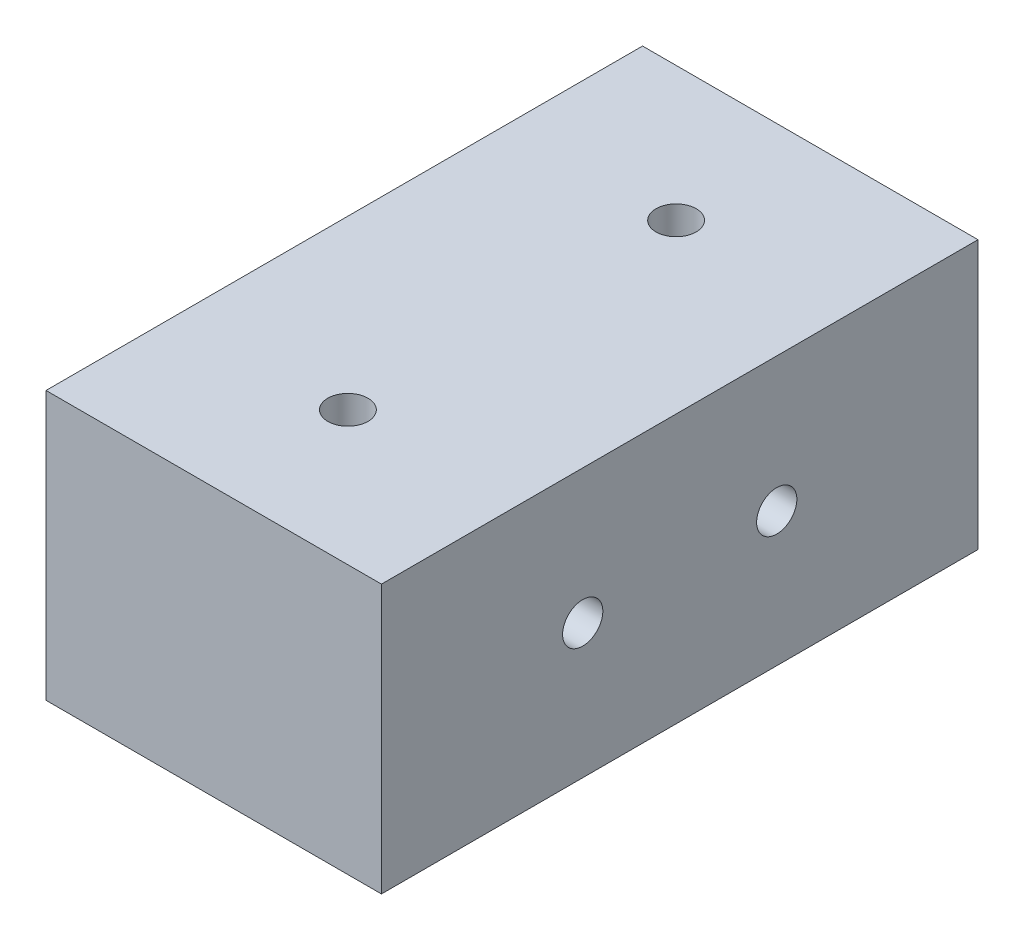
ISO-10303-21;
HEADER;
FILE_DESCRIPTION(('STEP AP214'),'2;1');
FILE_NAME('part.step','',(''),(''),'','','');
FILE_SCHEMA(('AUTOMOTIVE_DESIGN { 1 0 10303 214 1 1 1 1 }'));
ENDSEC;
DATA;
#1=APPLICATION_CONTEXT('core data for automotive mechanical design processes');
#2=APPLICATION_PROTOCOL_DEFINITION('international standard','automotive_design',2000,#1);
#3=PRODUCT_CONTEXT('',#1,'mechanical');
#4=PRODUCT('Part','Part','',(#3));
#5=PRODUCT_RELATED_PRODUCT_CATEGORY('part','',(#4));
#6=PRODUCT_DEFINITION_FORMATION('','',#4);
#7=PRODUCT_DEFINITION_CONTEXT('part definition',#1,'design');
#8=PRODUCT_DEFINITION('design','',#6,#7);
#9=PRODUCT_DEFINITION_SHAPE('','',#8);
#10=(LENGTH_UNIT() NAMED_UNIT(*) SI_UNIT(.MILLI.,.METRE.));
#11=(NAMED_UNIT(*) PLANE_ANGLE_UNIT() SI_UNIT($,.RADIAN.));
#12=(NAMED_UNIT(*) SI_UNIT($,.STERADIAN.) SOLID_ANGLE_UNIT());
#13=UNCERTAINTY_MEASURE_WITH_UNIT(LENGTH_MEASURE(1.E-05),#10,'distance_accuracy_value','');
#14=(GEOMETRIC_REPRESENTATION_CONTEXT(3) GLOBAL_UNCERTAINTY_ASSIGNED_CONTEXT((#13)) GLOBAL_UNIT_ASSIGNED_CONTEXT((#10,
#11,#12)) REPRESENTATION_CONTEXT('',''));
#15=CARTESIAN_POINT('',(0.,0.,0.));
#16=DIRECTION('',(0.,0.,1.));
#17=DIRECTION('',(1.,0.,0.));
#18=AXIS2_PLACEMENT_3D('',#15,#16,#17);
#19=CARTESIAN_POINT('',(25.,-20.,0.));
#20=DIRECTION('',(0.,0.,1.));
#21=DIRECTION('',(1.,0.,0.));
#22=AXIS2_PLACEMENT_3D('',#19,#20,#21);
#23=PLANE('',#22);
#24=DIRECTION('',(0.,1.,0.));
#25=VECTOR('',#24,1.);
#26=CARTESIAN_POINT('',(0.,-20.,0.));
#27=LINE('',#26,#25);
#28=CARTESIAN_POINT('',(0.,-20.,0.));
#29=VERTEX_POINT('',#28);
#30=CARTESIAN_POINT('',(0.,0.,0.));
#31=VERTEX_POINT('',#30);
#32=EDGE_CURVE('E101',#29,#31,#27,.T.);
#33=ORIENTED_EDGE('',*,*,#32,.T.);
#34=DIRECTION('',(-1.,0.,0.));
#35=VECTOR('',#34,1.);
#36=CARTESIAN_POINT('',(25.,0.,0.));
#37=LINE('',#36,#35);
#38=CARTESIAN_POINT('',(25.,0.,0.));
#39=VERTEX_POINT('',#38);
#40=EDGE_CURVE('E11',#39,#31,#37,.T.);
#41=ORIENTED_EDGE('',*,*,#40,.F.);
#42=DIRECTION('',(0.,1.,0.));
#43=VECTOR('',#42,1.);
#44=CARTESIAN_POINT('',(25.,-20.,0.));
#45=LINE('',#44,#43);
#46=CARTESIAN_POINT('',(25.,-20.,0.));
#47=VERTEX_POINT('',#46);
#48=EDGE_CURVE('E88',#47,#39,#45,.T.);
#49=ORIENTED_EDGE('',*,*,#48,.F.);
#50=DIRECTION('',(-1.,0.,0.));
#51=VECTOR('',#50,1.);
#52=CARTESIAN_POINT('',(25.,-20.,0.));
#53=LINE('',#52,#51);
#54=EDGE_CURVE('E97',#47,#29,#53,.T.);
#55=ORIENTED_EDGE('',*,*,#54,.T.);
#56=EDGE_LOOP('',(#33,#41,#49,#55));
#57=FACE_BOUND('',#56,.T.);
#58=ADVANCED_FACE('F35',(#57),#23,.F.);
#59=CARTESIAN_POINT('',(25.,0.,0.));
#60=DIRECTION('',(0.,-1.,0.));
#61=DIRECTION('',(0.,0.,-1.));
#62=AXIS2_PLACEMENT_3D('',#59,#60,#61);
#63=PLANE('',#62);
#64=CARTESIAN_POINT('',(12.5,0.,34.4603207010313));
#65=DIRECTION('',(0.,-1.,0.));
#66=DIRECTION('',(0.,0.,-1.));
#67=AXIS2_PLACEMENT_3D('',#64,#65,#66);
#68=CIRCLE('',#67,1.5);
#69=CARTESIAN_POINT('',(12.5,0.,32.9603207010313));
#70=VERTEX_POINT('',#69);
#71=EDGE_CURVE('E116',#70,#70,#68,.T.);
#72=ORIENTED_EDGE('',*,*,#71,.T.);
#73=EDGE_LOOP('',(#72));
#74=FACE_BOUND('',#73,.T.);
#75=CARTESIAN_POINT('',(12.5,0.,10.));
#76=DIRECTION('',(0.,-1.,0.));
#77=DIRECTION('',(0.,0.,-1.));
#78=AXIS2_PLACEMENT_3D('',#75,#76,#77);
#79=CIRCLE('',#78,1.5);
#80=CARTESIAN_POINT('',(12.5,0.,8.5));
#81=VERTEX_POINT('',#80);
#82=EDGE_CURVE('E104',#81,#81,#79,.T.);
#83=ORIENTED_EDGE('',*,*,#82,.T.);
#84=EDGE_LOOP('',(#83));
#85=FACE_BOUND('',#84,.T.);
#86=DIRECTION('',(0.,0.,1.));
#87=VECTOR('',#86,1.);
#88=CARTESIAN_POINT('',(0.,0.,0.));
#89=LINE('',#88,#87);
#90=CARTESIAN_POINT('',(0.,0.,44.4603207010313));
#91=VERTEX_POINT('',#90);
#92=EDGE_CURVE('E92',#31,#91,#89,.T.);
#93=ORIENTED_EDGE('',*,*,#92,.T.);
#94=DIRECTION('',(-1.,0.,0.));
#95=VECTOR('',#94,1.);
#96=CARTESIAN_POINT('',(25.,0.,44.4603207010313));
#97=LINE('',#96,#95);
#98=CARTESIAN_POINT('',(25.,0.,44.4603207010313));
#99=VERTEX_POINT('',#98);
#100=EDGE_CURVE('E44',#99,#91,#97,.T.);
#101=ORIENTED_EDGE('',*,*,#100,.F.);
#102=DIRECTION('',(0.,0.,1.));
#103=VECTOR('',#102,1.);
#104=CARTESIAN_POINT('',(25.,0.,0.));
#105=LINE('',#104,#103);
#106=EDGE_CURVE('E83',#39,#99,#105,.T.);
#107=ORIENTED_EDGE('',*,*,#106,.F.);
#108=ORIENTED_EDGE('',*,*,#40,.T.);
#109=EDGE_LOOP('',(#93,#101,#107,#108));
#110=FACE_BOUND('',#109,.T.);
#111=ADVANCED_FACE('F91',(#74,#85,#110),#63,.F.);
#112=CARTESIAN_POINT('',(25.,-20.,44.4603207010313));
#113=DIRECTION('',(0.,0.,-1.));
#114=DIRECTION('',(-1.,0.,0.));
#115=AXIS2_PLACEMENT_3D('',#112,#113,#114);
#116=PLANE('',#115);
#117=DIRECTION('',(0.,-1.,0.));
#118=VECTOR('',#117,1.);
#119=CARTESIAN_POINT('',(0.,-20.,44.4603207010313));
#120=LINE('',#119,#118);
#121=CARTESIAN_POINT('',(0.,-20.,44.4603207010313));
#122=VERTEX_POINT('',#121);
#123=EDGE_CURVE('E70',#91,#122,#120,.T.);
#124=ORIENTED_EDGE('',*,*,#123,.T.);
#125=DIRECTION('',(-1.,0.,0.));
#126=VECTOR('',#125,1.);
#127=CARTESIAN_POINT('',(25.,-20.,44.4603207010313));
#128=LINE('',#127,#126);
#129=CARTESIAN_POINT('',(25.,-20.,44.4603207010313));
#130=VERTEX_POINT('',#129);
#131=EDGE_CURVE('E93',#130,#122,#128,.T.);
#132=ORIENTED_EDGE('',*,*,#131,.F.);
#133=DIRECTION('',(0.,-1.,0.));
#134=VECTOR('',#133,1.);
#135=CARTESIAN_POINT('',(25.,-20.,44.4603207010313));
#136=LINE('',#135,#134);
#137=EDGE_CURVE('E86',#99,#130,#136,.T.);
#138=ORIENTED_EDGE('',*,*,#137,.F.);
#139=ORIENTED_EDGE('',*,*,#100,.T.);
#140=EDGE_LOOP('',(#124,#132,#138,#139));
#141=FACE_BOUND('',#140,.T.);
#142=ADVANCED_FACE('F95',(#141),#116,.F.);
#143=CARTESIAN_POINT('',(25.,-20.,0.));
#144=DIRECTION('',(0.,1.,0.));
#145=DIRECTION('',(0.,0.,1.));
#146=AXIS2_PLACEMENT_3D('',#143,#144,#145);
#147=PLANE('',#146);
#148=CARTESIAN_POINT('',(12.5,-20.,34.4603207010313));
#149=DIRECTION('',(0.,-1.,0.));
#150=DIRECTION('',(0.,0.,-1.));
#151=AXIS2_PLACEMENT_3D('',#148,#149,#150);
#152=CIRCLE('',#151,1.5);
#153=CARTESIAN_POINT('',(12.5,-20.,32.9603207010313));
#154=VERTEX_POINT('',#153);
#155=EDGE_CURVE('E111',#154,#154,#152,.T.);
#156=ORIENTED_EDGE('',*,*,#155,.F.);
#157=EDGE_LOOP('',(#156));
#158=FACE_BOUND('',#157,.T.);
#159=CARTESIAN_POINT('',(12.5,-20.,10.));
#160=DIRECTION('',(0.,-1.,0.));
#161=DIRECTION('',(0.,0.,-1.));
#162=AXIS2_PLACEMENT_3D('',#159,#160,#161);
#163=CIRCLE('',#162,1.5);
#164=CARTESIAN_POINT('',(12.5,-20.,8.5));
#165=VERTEX_POINT('',#164);
#166=EDGE_CURVE('E127',#165,#165,#163,.T.);
#167=ORIENTED_EDGE('',*,*,#166,.F.);
#168=EDGE_LOOP('',(#167));
#169=FACE_BOUND('',#168,.T.);
#170=DIRECTION('',(0.,0.,-1.));
#171=VECTOR('',#170,1.);
#172=CARTESIAN_POINT('',(0.,-20.,0.));
#173=LINE('',#172,#171);
#174=EDGE_CURVE('E76',#122,#29,#173,.T.);
#175=ORIENTED_EDGE('',*,*,#174,.T.);
#176=ORIENTED_EDGE('',*,*,#54,.F.);
#177=DIRECTION('',(0.,0.,-1.));
#178=VECTOR('',#177,1.);
#179=CARTESIAN_POINT('',(25.,-20.,0.));
#180=LINE('',#179,#178);
#181=EDGE_CURVE('E53',#130,#47,#180,.T.);
#182=ORIENTED_EDGE('',*,*,#181,.F.);
#183=ORIENTED_EDGE('',*,*,#131,.T.);
#184=EDGE_LOOP('',(#175,#176,#182,#183));
#185=FACE_BOUND('',#184,.T.);
#186=ADVANCED_FACE('F136',(#158,#169,#185),#147,.F.);
#187=CARTESIAN_POINT('',(25.,0.,0.));
#188=DIRECTION('',(1.,0.,0.));
#189=DIRECTION('',(0.,0.,-1.));
#190=AXIS2_PLACEMENT_3D('',#187,#188,#189);
#191=PLANE('',#190);
#192=CARTESIAN_POINT('',(25.,-10.,15.));
#193=DIRECTION('',(1.,0.,0.));
#194=DIRECTION('',(0.,0.,-1.));
#195=AXIS2_PLACEMENT_3D('',#192,#193,#194);
#196=CIRCLE('',#195,1.5);
#197=CARTESIAN_POINT('',(25.,-10.,13.5));
#198=VERTEX_POINT('',#197);
#199=EDGE_CURVE('E123',#198,#198,#196,.T.);
#200=ORIENTED_EDGE('',*,*,#199,.F.);
#201=EDGE_LOOP('',(#200));
#202=FACE_BOUND('',#201,.T.);
#203=CARTESIAN_POINT('',(25.,-10.,29.4603207010313));
#204=DIRECTION('',(1.,0.,0.));
#205=DIRECTION('',(0.,0.,-1.));
#206=AXIS2_PLACEMENT_3D('',#203,#204,#205);
#207=CIRCLE('',#206,1.5);
#208=CARTESIAN_POINT('',(25.,-10.,27.9603207010313));
#209=VERTEX_POINT('',#208);
#210=EDGE_CURVE('E112',#209,#209,#207,.T.);
#211=ORIENTED_EDGE('',*,*,#210,.F.);
#212=EDGE_LOOP('',(#211));
#213=FACE_BOUND('',#212,.T.);
#214=ORIENTED_EDGE('',*,*,#48,.T.);
#215=ORIENTED_EDGE('',*,*,#106,.T.);
#216=ORIENTED_EDGE('',*,*,#137,.T.);
#217=ORIENTED_EDGE('',*,*,#181,.T.);
#218=EDGE_LOOP('',(#214,#215,#216,#217));
#219=FACE_BOUND('',#218,.T.);
#220=ADVANCED_FACE('F84',(#202,#213,#219),#191,.T.);
#221=CARTESIAN_POINT('',(0.,0.,0.));
#222=DIRECTION('',(1.,0.,0.));
#223=DIRECTION('',(0.,0.,-1.));
#224=AXIS2_PLACEMENT_3D('',#221,#222,#223);
#225=PLANE('',#224);
#226=CARTESIAN_POINT('',(0.,-10.,15.));
#227=DIRECTION('',(1.,0.,0.));
#228=DIRECTION('',(0.,0.,-1.));
#229=AXIS2_PLACEMENT_3D('',#226,#227,#228);
#230=CIRCLE('',#229,1.5);
#231=CARTESIAN_POINT('',(0.,-10.,13.5));
#232=VERTEX_POINT('',#231);
#233=EDGE_CURVE('E38',#232,#232,#230,.T.);
#234=ORIENTED_EDGE('',*,*,#233,.T.);
#235=EDGE_LOOP('',(#234));
#236=FACE_BOUND('',#235,.T.);
#237=CARTESIAN_POINT('',(0.,-10.,29.4603207010313));
#238=DIRECTION('',(1.,0.,0.));
#239=DIRECTION('',(0.,0.,-1.));
#240=AXIS2_PLACEMENT_3D('',#237,#238,#239);
#241=CIRCLE('',#240,1.5);
#242=CARTESIAN_POINT('',(0.,-10.,27.9603207010313));
#243=VERTEX_POINT('',#242);
#244=EDGE_CURVE('E109',#243,#243,#241,.T.);
#245=ORIENTED_EDGE('',*,*,#244,.T.);
#246=EDGE_LOOP('',(#245));
#247=FACE_BOUND('',#246,.T.);
#248=ORIENTED_EDGE('',*,*,#32,.F.);
#249=ORIENTED_EDGE('',*,*,#174,.F.);
#250=ORIENTED_EDGE('',*,*,#123,.F.);
#251=ORIENTED_EDGE('',*,*,#92,.F.);
#252=EDGE_LOOP('',(#248,#249,#250,#251));
#253=FACE_BOUND('',#252,.T.);
#254=ADVANCED_FACE('F145',(#236,#247,#253),#225,.F.);
#255=CARTESIAN_POINT('',(12.5,0.,10.));
#256=DIRECTION('',(0.,-1.,0.));
#257=DIRECTION('',(0.,0.,-1.));
#258=AXIS2_PLACEMENT_3D('',#255,#256,#257);
#259=CYLINDRICAL_SURFACE('',#258,1.5);
#260=ORIENTED_EDGE('',*,*,#82,.F.);
#261=EDGE_LOOP('',(#260));
#262=FACE_BOUND('',#261,.T.);
#263=ORIENTED_EDGE('',*,*,#166,.T.);
#264=EDGE_LOOP('',(#263));
#265=FACE_BOUND('',#264,.T.);
#266=ADVANCED_FACE('F134',(#262,#265),#259,.F.);
#267=CARTESIAN_POINT('',(12.5,0.,34.4603207010313));
#268=DIRECTION('',(0.,-1.,0.));
#269=DIRECTION('',(0.,0.,-1.));
#270=AXIS2_PLACEMENT_3D('',#267,#268,#269);
#271=CYLINDRICAL_SURFACE('',#270,1.5);
#272=ORIENTED_EDGE('',*,*,#71,.F.);
#273=EDGE_LOOP('',(#272));
#274=FACE_BOUND('',#273,.T.);
#275=ORIENTED_EDGE('',*,*,#155,.T.);
#276=EDGE_LOOP('',(#275));
#277=FACE_BOUND('',#276,.T.);
#278=ADVANCED_FACE('F166',(#274,#277),#271,.F.);
#279=CARTESIAN_POINT('',(-25.,-10.,29.4603207010313));
#280=DIRECTION('',(1.,0.,0.));
#281=DIRECTION('',(0.,0.,-1.));
#282=AXIS2_PLACEMENT_3D('',#279,#280,#281);
#283=CYLINDRICAL_SURFACE('',#282,1.5);
#284=ORIENTED_EDGE('',*,*,#210,.T.);
#285=EDGE_LOOP('',(#284));
#286=FACE_BOUND('',#285,.T.);
#287=ORIENTED_EDGE('',*,*,#244,.F.);
#288=EDGE_LOOP('',(#287));
#289=FACE_BOUND('',#288,.T.);
#290=ADVANCED_FACE('F172',(#286,#289),#283,.F.);
#291=CARTESIAN_POINT('',(-25.,-10.,15.));
#292=DIRECTION('',(1.,0.,0.));
#293=DIRECTION('',(0.,0.,-1.));
#294=AXIS2_PLACEMENT_3D('',#291,#292,#293);
#295=CYLINDRICAL_SURFACE('',#294,1.5);
#296=ORIENTED_EDGE('',*,*,#199,.T.);
#297=EDGE_LOOP('',(#296));
#298=FACE_BOUND('',#297,.T.);
#299=ORIENTED_EDGE('',*,*,#233,.F.);
#300=EDGE_LOOP('',(#299));
#301=FACE_BOUND('',#300,.T.);
#302=ADVANCED_FACE('F176',(#298,#301),#295,.F.);
#303=CLOSED_SHELL('',(#58,#111,#142,#186,#220,#254,#266,#278,#290,#302));
#304=MANIFOLD_SOLID_BREP('B2',#303);
#305=ADVANCED_BREP_SHAPE_REPRESENTATION('',(#18,#304),#14);
#306=SHAPE_DEFINITION_REPRESENTATION(#9,#305);
ENDSEC;
END-ISO-10303-21;
